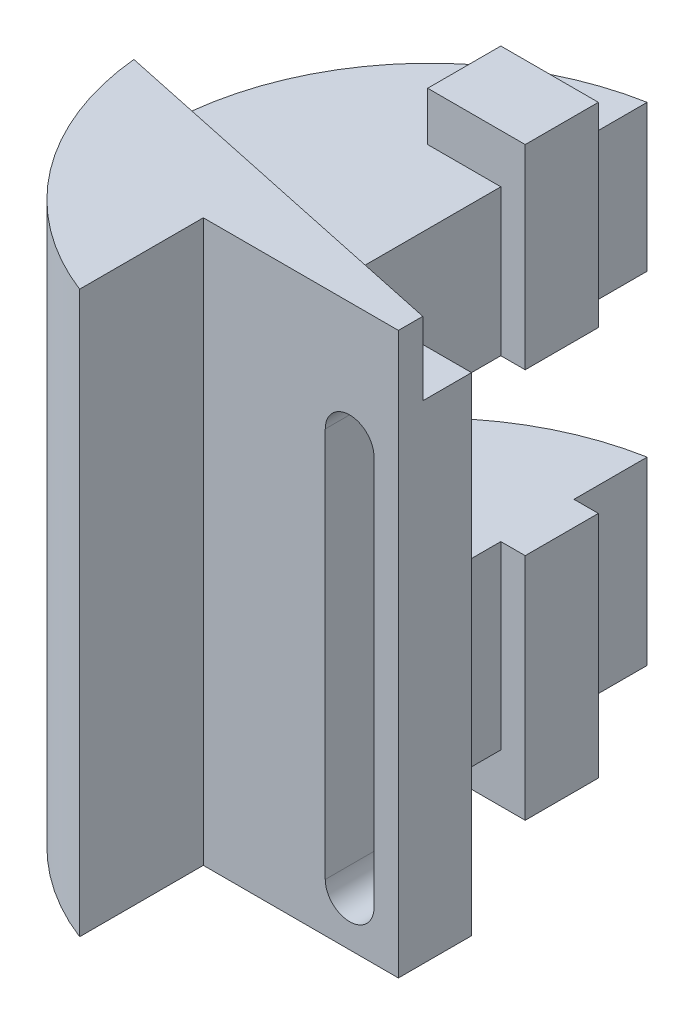
ISO-10303-21;
HEADER;
FILE_DESCRIPTION(('STEP AP214'),'2;1');
FILE_NAME('part.step','',(''),(''),'','','');
FILE_SCHEMA(('AUTOMOTIVE_DESIGN { 1 0 10303 214 1 1 1 1 }'));
ENDSEC;
DATA;
#1=APPLICATION_CONTEXT('core data for automotive mechanical design processes');
#2=APPLICATION_PROTOCOL_DEFINITION('international standard','automotive_design',2000,#1);
#3=PRODUCT_CONTEXT('',#1,'mechanical');
#4=PRODUCT('Part','Part','',(#3));
#5=PRODUCT_RELATED_PRODUCT_CATEGORY('part','',(#4));
#6=PRODUCT_DEFINITION_FORMATION('','',#4);
#7=PRODUCT_DEFINITION_CONTEXT('part definition',#1,'design');
#8=PRODUCT_DEFINITION('design','',#6,#7);
#9=PRODUCT_DEFINITION_SHAPE('','',#8);
#10=(LENGTH_UNIT() NAMED_UNIT(*) SI_UNIT(.MILLI.,.METRE.));
#11=(NAMED_UNIT(*) PLANE_ANGLE_UNIT() SI_UNIT($,.RADIAN.));
#12=(NAMED_UNIT(*) SI_UNIT($,.STERADIAN.) SOLID_ANGLE_UNIT());
#13=UNCERTAINTY_MEASURE_WITH_UNIT(LENGTH_MEASURE(1.E-05),#10,'distance_accuracy_value','');
#14=(GEOMETRIC_REPRESENTATION_CONTEXT(3) GLOBAL_UNCERTAINTY_ASSIGNED_CONTEXT((#13)) GLOBAL_UNIT_ASSIGNED_CONTEXT((#10,
#11,#12)) REPRESENTATION_CONTEXT('',''));
#15=CARTESIAN_POINT('',(0.,0.,0.));
#16=DIRECTION('',(0.,0.,1.));
#17=DIRECTION('',(1.,0.,0.));
#18=AXIS2_PLACEMENT_3D('',#15,#16,#17);
#19=CARTESIAN_POINT('',(9.99999999999999,115.,-40.3627969821569));
#20=DIRECTION('',(-1.,0.,0.));
#21=DIRECTION('',(0.,0.,1.));
#22=AXIS2_PLACEMENT_3D('',#19,#20,#21);
#23=PLANE('',#22);
#24=DIRECTION('',(0.,-1.,0.));
#25=VECTOR('',#24,1.);
#26=CARTESIAN_POINT('',(9.99999999999999,115.,-106.362796982157));
#27=LINE('',#26,#25);
#28=CARTESIAN_POINT('',(9.99999999999997,37.,-106.362796982157));
#29=VERTEX_POINT('',#28);
#30=CARTESIAN_POINT('',(9.99999999999999,0.,-106.362796982157));
#31=VERTEX_POINT('',#30);
#32=EDGE_CURVE('E362',#29,#31,#27,.T.);
#33=ORIENTED_EDGE('',*,*,#32,.F.);
#34=DIRECTION('',(0.,0.,1.));
#35=VECTOR('',#34,1.);
#36=CARTESIAN_POINT('',(9.99999999999999,37.,-40.3627969821569));
#37=LINE('',#36,#35);
#38=CARTESIAN_POINT('',(9.99999999999999,37.,-91.362796982157));
#39=VERTEX_POINT('',#38);
#40=EDGE_CURVE('E272',#29,#39,#37,.T.);
#41=ORIENTED_EDGE('',*,*,#40,.T.);
#42=DIRECTION('',(0.,-1.,0.));
#43=VECTOR('',#42,1.);
#44=CARTESIAN_POINT('',(9.99999999999999,115.,-91.362796982157));
#45=LINE('',#44,#43);
#46=CARTESIAN_POINT('',(9.99999999999999,0.,-91.362796982157));
#47=VERTEX_POINT('',#46);
#48=EDGE_CURVE('E323',#39,#47,#45,.T.);
#49=ORIENTED_EDGE('',*,*,#48,.T.);
#50=DIRECTION('',(0.,0.,-1.));
#51=VECTOR('',#50,1.);
#52=CARTESIAN_POINT('',(9.99999999999999,0.,-40.3627969821569));
#53=LINE('',#52,#51);
#54=EDGE_CURVE('E375',#47,#31,#53,.T.);
#55=ORIENTED_EDGE('',*,*,#54,.T.);
#56=EDGE_LOOP('',(#33,#41,#49,#55));
#57=FACE_BOUND('',#56,.T.);
#58=ADVANCED_FACE('F39',(#57),#23,.F.);
#59=CARTESIAN_POINT('',(-5.00000000000001,-45.,-91.362796982157));
#60=DIRECTION('',(0.,0.,-1.));
#61=DIRECTION('',(-1.,0.,0.));
#62=AXIS2_PLACEMENT_3D('',#59,#60,#61);
#63=PLANE('',#62);
#64=DIRECTION('',(-1.,0.,0.));
#65=VECTOR('',#64,1.);
#66=CARTESIAN_POINT('',(-5.00000000000001,37.,-91.362796982157));
#67=LINE('',#66,#65);
#68=CARTESIAN_POINT('',(15.,37.,-91.362796982157));
#69=VERTEX_POINT('',#68);
#70=EDGE_CURVE('E270',#69,#39,#67,.T.);
#71=ORIENTED_EDGE('',*,*,#70,.F.);
#72=DIRECTION('',(0.,1.,0.));
#73=VECTOR('',#72,1.);
#74=CARTESIAN_POINT('',(15.,-45.,-91.362796982157));
#75=LINE('',#74,#73);
#76=CARTESIAN_POINT('',(15.,-10.,-91.362796982157));
#77=VERTEX_POINT('',#76);
#78=EDGE_CURVE('E305',#77,#69,#75,.T.);
#79=ORIENTED_EDGE('',*,*,#78,.F.);
#80=DIRECTION('',(1.,0.,0.));
#81=VECTOR('',#80,1.);
#82=CARTESIAN_POINT('',(-5.00000000000001,-10.,-91.362796982157));
#83=LINE('',#82,#81);
#84=CARTESIAN_POINT('',(-5.00000000000001,-10.,-91.362796982157));
#85=VERTEX_POINT('',#84);
#86=EDGE_CURVE('E284',#85,#77,#83,.T.);
#87=ORIENTED_EDGE('',*,*,#86,.F.);
#88=DIRECTION('',(0.,1.,0.));
#89=VECTOR('',#88,1.);
#90=CARTESIAN_POINT('',(-5.00000000000001,-45.,-91.362796982157));
#91=LINE('',#90,#89);
#92=CARTESIAN_POINT('',(-5.00000000000002,0.,-91.362796982157));
#93=VERTEX_POINT('',#92);
#94=EDGE_CURVE('E285',#85,#93,#91,.T.);
#95=ORIENTED_EDGE('',*,*,#94,.T.);
#96=DIRECTION('',(-1.,0.,0.));
#97=VECTOR('',#96,1.);
#98=CARTESIAN_POINT('',(20.,0.,-91.362796982157));
#99=LINE('',#98,#97);
#100=EDGE_CURVE('E327',#47,#93,#99,.T.);
#101=ORIENTED_EDGE('',*,*,#100,.F.);
#102=ORIENTED_EDGE('',*,*,#48,.F.);
#103=EDGE_LOOP('',(#71,#79,#87,#95,#101,#102));
#104=FACE_BOUND('',#103,.T.);
#105=ADVANCED_FACE('F434',(#104),#63,.T.);
#106=CARTESIAN_POINT('',(-5.00000000000001,-45.,-76.362796982157));
#107=DIRECTION('',(0.,0.,1.));
#108=DIRECTION('',(1.,0.,0.));
#109=AXIS2_PLACEMENT_3D('',#106,#107,#108);
#110=PLANE('',#109);
#111=DIRECTION('',(1.,0.,0.));
#112=VECTOR('',#111,1.);
#113=CARTESIAN_POINT('',(-5.00000000000001,37.,-76.362796982157));
#114=LINE('',#113,#112);
#115=CARTESIAN_POINT('',(9.99999999999999,37.,-76.362796982157));
#116=VERTEX_POINT('',#115);
#117=CARTESIAN_POINT('',(15.,37.,-76.362796982157));
#118=VERTEX_POINT('',#117);
#119=EDGE_CURVE('E265',#116,#118,#114,.T.);
#120=ORIENTED_EDGE('',*,*,#119,.F.);
#121=DIRECTION('',(0.,1.,0.));
#122=VECTOR('',#121,1.);
#123=CARTESIAN_POINT('',(9.99999999999999,115.,-76.362796982157));
#124=LINE('',#123,#122);
#125=CARTESIAN_POINT('',(9.99999999999999,0.,-76.362796982157));
#126=VERTEX_POINT('',#125);
#127=EDGE_CURVE('E318',#126,#116,#124,.T.);
#128=ORIENTED_EDGE('',*,*,#127,.F.);
#129=DIRECTION('',(1.,0.,0.));
#130=VECTOR('',#129,1.);
#131=CARTESIAN_POINT('',(20.,0.,-76.362796982157));
#132=LINE('',#131,#130);
#133=CARTESIAN_POINT('',(-5.00000000000001,0.,-76.362796982157));
#134=VERTEX_POINT('',#133);
#135=EDGE_CURVE('E321',#134,#126,#132,.T.);
#136=ORIENTED_EDGE('',*,*,#135,.F.);
#137=DIRECTION('',(0.,1.,0.));
#138=VECTOR('',#137,1.);
#139=CARTESIAN_POINT('',(-5.00000000000001,-45.,-76.362796982157));
#140=LINE('',#139,#138);
#141=CARTESIAN_POINT('',(-5.00000000000001,-10.,-76.362796982157));
#142=VERTEX_POINT('',#141);
#143=EDGE_CURVE('E313',#142,#134,#140,.T.);
#144=ORIENTED_EDGE('',*,*,#143,.F.);
#145=DIRECTION('',(-1.,0.,0.));
#146=VECTOR('',#145,1.);
#147=CARTESIAN_POINT('',(-5.00000000000001,-10.,-76.362796982157));
#148=LINE('',#147,#146);
#149=CARTESIAN_POINT('',(15.,-10.,-76.362796982157));
#150=VERTEX_POINT('',#149);
#151=EDGE_CURVE('E289',#150,#142,#148,.T.);
#152=ORIENTED_EDGE('',*,*,#151,.F.);
#153=DIRECTION('',(0.,1.,0.));
#154=VECTOR('',#153,1.);
#155=CARTESIAN_POINT('',(15.,-45.,-76.362796982157));
#156=LINE('',#155,#154);
#157=EDGE_CURVE('E309',#150,#118,#156,.T.);
#158=ORIENTED_EDGE('',*,*,#157,.T.);
#159=EDGE_LOOP('',(#120,#128,#136,#144,#152,#158));
#160=FACE_BOUND('',#159,.T.);
#161=ADVANCED_FACE('F442',(#160),#110,.T.);
#162=CARTESIAN_POINT('',(15.,-45.,-91.362796982157));
#163=DIRECTION('',(1.,0.,0.));
#164=DIRECTION('',(0.,0.,-1.));
#165=AXIS2_PLACEMENT_3D('',#162,#163,#164);
#166=PLANE('',#165);
#167=DIRECTION('',(0.,0.,-1.));
#168=VECTOR('',#167,1.);
#169=CARTESIAN_POINT('',(15.,37.,-91.3627969821569));
#170=LINE('',#169,#168);
#171=EDGE_CURVE('E405',#118,#69,#170,.T.);
#172=ORIENTED_EDGE('',*,*,#171,.F.);
#173=ORIENTED_EDGE('',*,*,#157,.F.);
#174=DIRECTION('',(0.,0.,1.));
#175=VECTOR('',#174,1.);
#176=CARTESIAN_POINT('',(15.,-10.,-91.362796982157));
#177=LINE('',#176,#175);
#178=EDGE_CURVE('E282',#77,#150,#177,.T.);
#179=ORIENTED_EDGE('',*,*,#178,.F.);
#180=ORIENTED_EDGE('',*,*,#78,.T.);
#181=EDGE_LOOP('',(#172,#173,#179,#180));
#182=FACE_BOUND('',#181,.T.);
#183=ADVANCED_FACE('F450',(#182),#166,.T.);
#184=CARTESIAN_POINT('',(9.99999999999999,100.,-91.362796982157));
#185=VERTEX_POINT('',#184);
#186=CARTESIAN_POINT('',(9.99999999999999,70.,-91.362796982157));
#187=VERTEX_POINT('',#186);
#188=EDGE_CURVE('E324',#185,#187,#45,.T.);
#189=ORIENTED_EDGE('',*,*,#188,.T.);
#190=DIRECTION('',(0.,0.,-1.));
#191=VECTOR('',#190,1.);
#192=CARTESIAN_POINT('',(9.99999999999999,70.,-40.3627969821569));
#193=LINE('',#192,#191);
#194=CARTESIAN_POINT('',(9.99999999999997,70.,-106.362796982157));
#195=VERTEX_POINT('',#194);
#196=EDGE_CURVE('E259',#187,#195,#193,.T.);
#197=ORIENTED_EDGE('',*,*,#196,.T.);
#198=CARTESIAN_POINT('',(10.,100.,-106.362796982157));
#199=VERTEX_POINT('',#198);
#200=EDGE_CURVE('E378',#199,#195,#27,.T.);
#201=ORIENTED_EDGE('',*,*,#200,.F.);
#202=DIRECTION('',(0.,0.,-1.));
#203=VECTOR('',#202,1.);
#204=CARTESIAN_POINT('',(9.99999999999999,100.,-40.3627969821569));
#205=LINE('',#204,#203);
#206=EDGE_CURVE('E336',#185,#199,#205,.T.);
#207=ORIENTED_EDGE('',*,*,#206,.F.);
#208=EDGE_LOOP('',(#189,#197,#201,#207));
#209=FACE_BOUND('',#208,.T.);
#210=ADVANCED_FACE('F437',(#209),#23,.F.);
#211=CARTESIAN_POINT('',(40.,115.,-40.3627969821569));
#212=DIRECTION('',(0.,0.,1.));
#213=DIRECTION('',(1.,0.,0.));
#214=AXIS2_PLACEMENT_3D('',#211,#212,#213);
#215=PLANE('',#214);
#216=DIRECTION('',(0.,-1.,0.));
#217=VECTOR('',#216,1.);
#218=CARTESIAN_POINT('',(35.,90.,-40.3627969821569));
#219=LINE('',#218,#217);
#220=CARTESIAN_POINT('',(35.,90.,-40.3627969821569));
#221=VERTEX_POINT('',#220);
#222=CARTESIAN_POINT('',(35.,10.,-40.3627969821569));
#223=VERTEX_POINT('',#222);
#224=EDGE_CURVE('E230',#221,#223,#219,.T.);
#225=ORIENTED_EDGE('',*,*,#224,.F.);
#226=CARTESIAN_POINT('',(30.,90.,-40.3627969821569));
#227=DIRECTION('',(0.,0.,-1.));
#228=DIRECTION('',(-1.,0.,0.));
#229=AXIS2_PLACEMENT_3D('',#226,#227,#228);
#230=CIRCLE('',#229,5.);
#231=CARTESIAN_POINT('',(25.,90.,-40.3627969821569));
#232=VERTEX_POINT('',#231);
#233=EDGE_CURVE('E54',#232,#221,#230,.T.);
#234=ORIENTED_EDGE('',*,*,#233,.F.);
#235=DIRECTION('',(0.,1.,0.));
#236=VECTOR('',#235,1.);
#237=CARTESIAN_POINT('',(25.,90.,-40.3627969821569));
#238=LINE('',#237,#236);
#239=CARTESIAN_POINT('',(25.,10.,-40.3627969821569));
#240=VERTEX_POINT('',#239);
#241=EDGE_CURVE('E237',#240,#232,#238,.T.);
#242=ORIENTED_EDGE('',*,*,#241,.F.);
#243=CARTESIAN_POINT('',(30.,10.,-40.3627969821569));
#244=DIRECTION('',(0.,0.,-1.));
#245=DIRECTION('',(-1.,0.,0.));
#246=AXIS2_PLACEMENT_3D('',#243,#244,#245);
#247=CIRCLE('',#246,5.);
#248=EDGE_CURVE('E221',#223,#240,#247,.T.);
#249=ORIENTED_EDGE('',*,*,#248,.F.);
#250=EDGE_LOOP('',(#225,#234,#242,#249));
#251=FACE_BOUND('',#250,.T.);
#252=DIRECTION('',(-1.,0.,0.));
#253=VECTOR('',#252,1.);
#254=CARTESIAN_POINT('',(40.,100.,-40.3627969821569));
#255=LINE('',#254,#253);
#256=CARTESIAN_POINT('',(40.,100.,-40.3627969821569));
#257=VERTEX_POINT('',#256);
#258=CARTESIAN_POINT('',(9.99999999999999,100.,-40.3627969821569));
#259=VERTEX_POINT('',#258);
#260=EDGE_CURVE('E334',#257,#259,#255,.T.);
#261=ORIENTED_EDGE('',*,*,#260,.F.);
#262=DIRECTION('',(0.,-1.,0.));
#263=VECTOR('',#262,1.);
#264=CARTESIAN_POINT('',(40.,115.,-40.3627969821569));
#265=LINE('',#264,#263);
#266=CARTESIAN_POINT('',(40.,0.,-40.3627969821569));
#267=VERTEX_POINT('',#266);
#268=EDGE_CURVE('E383',#257,#267,#265,.T.);
#269=ORIENTED_EDGE('',*,*,#268,.T.);
#270=DIRECTION('',(-1.,0.,0.));
#271=VECTOR('',#270,1.);
#272=CARTESIAN_POINT('',(40.,0.,-40.3627969821569));
#273=LINE('',#272,#271);
#274=CARTESIAN_POINT('',(9.99999999999999,0.,-40.3627969821569));
#275=VERTEX_POINT('',#274);
#276=EDGE_CURVE('E372',#267,#275,#273,.T.);
#277=ORIENTED_EDGE('',*,*,#276,.T.);
#278=DIRECTION('',(0.,-1.,0.));
#279=VECTOR('',#278,1.);
#280=CARTESIAN_POINT('',(9.99999999999999,115.,-40.3627969821569));
#281=LINE('',#280,#279);
#282=EDGE_CURVE('E381',#259,#275,#281,.T.);
#283=ORIENTED_EDGE('',*,*,#282,.F.);
#284=EDGE_LOOP('',(#261,#269,#277,#283));
#285=FACE_BOUND('',#284,.T.);
#286=ADVANCED_FACE('F234',(#251,#285),#215,.F.);
#287=ORIENTED_EDGE('',*,*,#127,.T.);
#288=DIRECTION('',(0.,0.,1.));
#289=VECTOR('',#288,1.);
#290=CARTESIAN_POINT('',(9.99999999999999,37.,-40.3627969821569));
#291=LINE('',#290,#289);
#292=CARTESIAN_POINT('',(9.99999999999999,37.,-66.3627969821569));
#293=VERTEX_POINT('',#292);
#294=EDGE_CURVE('E267',#116,#293,#291,.T.);
#295=ORIENTED_EDGE('',*,*,#294,.T.);
#296=DIRECTION('',(0.,1.,0.));
#297=VECTOR('',#296,1.);
#298=CARTESIAN_POINT('',(9.99999999999999,115.,-66.3627969821569));
#299=LINE('',#298,#297);
#300=CARTESIAN_POINT('',(9.99999999999999,70.,-66.3627969821569));
#301=VERTEX_POINT('',#300);
#302=EDGE_CURVE('E278',#293,#301,#299,.T.);
#303=ORIENTED_EDGE('',*,*,#302,.T.);
#304=DIRECTION('',(0.,0.,-1.));
#305=VECTOR('',#304,1.);
#306=CARTESIAN_POINT('',(9.99999999999999,70.,-40.3627969821569));
#307=LINE('',#306,#305);
#308=CARTESIAN_POINT('',(9.99999999999999,70.,-76.362796982157));
#309=VERTEX_POINT('',#308);
#310=EDGE_CURVE('E254',#301,#309,#307,.T.);
#311=ORIENTED_EDGE('',*,*,#310,.T.);
#312=CARTESIAN_POINT('',(10.,100.,-76.362796982157));
#313=VERTEX_POINT('',#312);
#314=EDGE_CURVE('E317',#309,#313,#124,.T.);
#315=ORIENTED_EDGE('',*,*,#314,.T.);
#316=EDGE_CURVE('E337',#259,#313,#205,.T.);
#317=ORIENTED_EDGE('',*,*,#316,.F.);
#318=ORIENTED_EDGE('',*,*,#282,.T.);
#319=EDGE_CURVE('E355',#275,#126,#53,.T.);
#320=ORIENTED_EDGE('',*,*,#319,.T.);
#321=EDGE_LOOP('',(#287,#295,#303,#311,#315,#317,#318,#320));
#322=FACE_BOUND('',#321,.T.);
#323=ADVANCED_FACE('F438',(#322),#23,.F.);
#324=CARTESIAN_POINT('',(20.,115.,-51.7711309515255));
#325=DIRECTION('',(0.,-1.,0.));
#326=DIRECTION('',(0.,0.,-1.));
#327=AXIS2_PLACEMENT_3D('',#324,#325,#326);
#328=CYLINDRICAL_SURFACE('',#327,55.5);
#329=DIRECTION('',(0.,-1.,0.));
#330=VECTOR('',#329,1.);
#331=CARTESIAN_POINT('',(-33.5474862383895,115.,-66.3627969821569));
#332=LINE('',#331,#330);
#333=CARTESIAN_POINT('',(-33.5474862383895,70.,-66.3627969821569));
#334=VERTEX_POINT('',#333);
#335=CARTESIAN_POINT('',(-33.5474862383895,37.,-66.3627969821569));
#336=VERTEX_POINT('',#335);
#337=EDGE_CURVE('E407',#334,#336,#332,.T.);
#338=ORIENTED_EDGE('',*,*,#337,.T.);
#339=CARTESIAN_POINT('',(20.,37.,-51.7711309515255));
#340=DIRECTION('',(0.,-1.,0.));
#341=DIRECTION('',(0.,0.,-1.));
#342=AXIS2_PLACEMENT_3D('',#339,#340,#341);
#343=CIRCLE('',#342,55.5);
#344=EDGE_CURVE('E275',#336,#29,#343,.T.);
#345=ORIENTED_EDGE('',*,*,#344,.T.);
#346=ORIENTED_EDGE('',*,*,#32,.T.);
#347=CARTESIAN_POINT('',(20.,0.,-51.7711309515255));
#348=DIRECTION('',(0.,1.,0.));
#349=DIRECTION('',(0.,0.,1.));
#350=AXIS2_PLACEMENT_3D('',#347,#348,#349);
#351=CIRCLE('',#350,55.5);
#352=CARTESIAN_POINT('',(0.,0.,0.));
#353=VERTEX_POINT('',#352);
#354=EDGE_CURVE('E350',#31,#353,#351,.T.);
#355=ORIENTED_EDGE('',*,*,#354,.T.);
#356=DIRECTION('',(0.,-1.,0.));
#357=VECTOR('',#356,1.);
#358=CARTESIAN_POINT('',(0.,115.,0.));
#359=LINE('',#358,#357);
#360=CARTESIAN_POINT('',(0.,115.,0.));
#361=VERTEX_POINT('',#360);
#362=EDGE_CURVE('E391',#361,#353,#359,.T.);
#363=ORIENTED_EDGE('',*,*,#362,.F.);
#364=CARTESIAN_POINT('',(20.,115.,-51.7711309515255));
#365=DIRECTION('',(0.,1.,0.));
#366=DIRECTION('',(0.,0.,1.));
#367=AXIS2_PLACEMENT_3D('',#364,#365,#366);
#368=CIRCLE('',#367,55.5);
#369=CARTESIAN_POINT('',(-35.2350441418964,115.,-46.3544992820505));
#370=VERTEX_POINT('',#369);
#371=EDGE_CURVE('E352',#370,#361,#368,.T.);
#372=ORIENTED_EDGE('',*,*,#371,.F.);
#373=DIRECTION('',(0.,1.,0.));
#374=VECTOR('',#373,1.);
#375=CARTESIAN_POINT('',(-35.2350441418964,100.,-46.3544992820505));
#376=LINE('',#375,#374);
#377=CARTESIAN_POINT('',(-35.2350441418964,100.,-46.3544992820505));
#378=VERTEX_POINT('',#377);
#379=EDGE_CURVE('E345',#378,#370,#376,.T.);
#380=ORIENTED_EDGE('',*,*,#379,.F.);
#381=CARTESIAN_POINT('',(20.,100.,-51.7711309515255));
#382=DIRECTION('',(0.,1.,0.));
#383=DIRECTION('',(0.,0.,1.));
#384=AXIS2_PLACEMENT_3D('',#381,#382,#383);
#385=CIRCLE('',#384,55.5);
#386=EDGE_CURVE('E340',#199,#378,#385,.T.);
#387=ORIENTED_EDGE('',*,*,#386,.F.);
#388=ORIENTED_EDGE('',*,*,#200,.T.);
#389=CARTESIAN_POINT('',(20.,70.,-51.7711309515255));
#390=DIRECTION('',(0.,1.,0.));
#391=DIRECTION('',(0.,0.,1.));
#392=AXIS2_PLACEMENT_3D('',#389,#390,#391);
#393=CIRCLE('',#392,55.5);
#394=EDGE_CURVE('E262',#195,#334,#393,.T.);
#395=ORIENTED_EDGE('',*,*,#394,.T.);
#396=EDGE_LOOP('',(#338,#345,#346,#355,#363,#372,#380,#387,#388,#395));
#397=FACE_BOUND('',#396,.T.);
#398=ADVANCED_FACE('F41',(#397),#328,.T.);
#399=CARTESIAN_POINT('',(0.,115.,0.));
#400=DIRECTION('',(-1.,0.,0.));
#401=DIRECTION('',(0.,0.,1.));
#402=AXIS2_PLACEMENT_3D('',#399,#400,#401);
#403=PLANE('',#402);
#404=DIRECTION('',(0.,0.,-1.));
#405=VECTOR('',#404,1.);
#406=CARTESIAN_POINT('',(0.,0.,0.));
#407=LINE('',#406,#405);
#408=CARTESIAN_POINT('',(0.,0.,-25.3627969821569));
#409=VERTEX_POINT('',#408);
#410=EDGE_CURVE('E365',#353,#409,#407,.T.);
#411=ORIENTED_EDGE('',*,*,#410,.T.);
#412=DIRECTION('',(0.,-1.,0.));
#413=VECTOR('',#412,1.);
#414=CARTESIAN_POINT('',(0.,115.,-25.3627969821569));
#415=LINE('',#414,#413);
#416=CARTESIAN_POINT('',(0.,115.,-25.3627969821569));
#417=VERTEX_POINT('',#416);
#418=EDGE_CURVE('E388',#417,#409,#415,.T.);
#419=ORIENTED_EDGE('',*,*,#418,.F.);
#420=DIRECTION('',(0.,0.,-1.));
#421=VECTOR('',#420,1.);
#422=CARTESIAN_POINT('',(0.,115.,0.));
#423=LINE('',#422,#421);
#424=EDGE_CURVE('E354',#361,#417,#423,.T.);
#425=ORIENTED_EDGE('',*,*,#424,.F.);
#426=ORIENTED_EDGE('',*,*,#362,.T.);
#427=EDGE_LOOP('',(#411,#419,#425,#426));
#428=FACE_BOUND('',#427,.T.);
#429=ADVANCED_FACE('F458',(#428),#403,.F.);
#430=CARTESIAN_POINT('',(0.,115.,-25.3627969821569));
#431=DIRECTION('',(0.,0.,-1.));
#432=DIRECTION('',(-1.,0.,0.));
#433=AXIS2_PLACEMENT_3D('',#430,#431,#432);
#434=PLANE('',#433);
#435=DIRECTION('',(0.,1.,0.));
#436=VECTOR('',#435,1.);
#437=CARTESIAN_POINT('',(25.,115.,-25.3627969821569));
#438=LINE('',#437,#436);
#439=CARTESIAN_POINT('',(25.,10.,-25.3627969821569));
#440=VERTEX_POINT('',#439);
#441=CARTESIAN_POINT('',(25.,90.,-25.3627969821569));
#442=VERTEX_POINT('',#441);
#443=EDGE_CURVE('E47',#440,#442,#438,.T.);
#444=ORIENTED_EDGE('',*,*,#443,.T.);
#445=CARTESIAN_POINT('',(30.,90.,-25.3627969821569));
#446=DIRECTION('',(0.,0.,-1.));
#447=DIRECTION('',(-1.,0.,0.));
#448=AXIS2_PLACEMENT_3D('',#445,#446,#447);
#449=CIRCLE('',#448,5.);
#450=CARTESIAN_POINT('',(35.,90.,-25.3627969821569));
#451=VERTEX_POINT('',#450);
#452=EDGE_CURVE('E12',#442,#451,#449,.T.);
#453=ORIENTED_EDGE('',*,*,#452,.T.);
#454=DIRECTION('',(0.,-1.,0.));
#455=VECTOR('',#454,1.);
#456=CARTESIAN_POINT('',(35.,115.,-25.3627969821569));
#457=LINE('',#456,#455);
#458=CARTESIAN_POINT('',(35.,9.99999999999999,-25.3627969821569));
#459=VERTEX_POINT('',#458);
#460=EDGE_CURVE('E410',#451,#459,#457,.T.);
#461=ORIENTED_EDGE('',*,*,#460,.T.);
#462=CARTESIAN_POINT('',(30.,10.,-25.3627969821569));
#463=DIRECTION('',(0.,0.,-1.));
#464=DIRECTION('',(-1.,0.,0.));
#465=AXIS2_PLACEMENT_3D('',#462,#463,#464);
#466=CIRCLE('',#465,5.);
#467=EDGE_CURVE('E224',#459,#440,#466,.T.);
#468=ORIENTED_EDGE('',*,*,#467,.T.);
#469=EDGE_LOOP('',(#444,#453,#461,#468));
#470=FACE_BOUND('',#469,.T.);
#471=DIRECTION('',(1.,0.,0.));
#472=VECTOR('',#471,1.);
#473=CARTESIAN_POINT('',(0.,0.,-25.3627969821569));
#474=LINE('',#473,#472);
#475=CARTESIAN_POINT('',(40.,0.,-25.3627969821569));
#476=VERTEX_POINT('',#475);
#477=EDGE_CURVE('E367',#409,#476,#474,.T.);
#478=ORIENTED_EDGE('',*,*,#477,.T.);
#479=DIRECTION('',(0.,-1.,0.));
#480=VECTOR('',#479,1.);
#481=CARTESIAN_POINT('',(40.,115.,-25.3627969821569));
#482=LINE('',#481,#480);
#483=CARTESIAN_POINT('',(40.,115.,-25.3627969821569));
#484=VERTEX_POINT('',#483);
#485=EDGE_CURVE('E385',#484,#476,#482,.T.);
#486=ORIENTED_EDGE('',*,*,#485,.F.);
#487=DIRECTION('',(1.,0.,0.));
#488=VECTOR('',#487,1.);
#489=CARTESIAN_POINT('',(0.,115.,-25.3627969821569));
#490=LINE('',#489,#488);
#491=EDGE_CURVE('E357',#417,#484,#490,.T.);
#492=ORIENTED_EDGE('',*,*,#491,.F.);
#493=ORIENTED_EDGE('',*,*,#418,.T.);
#494=EDGE_LOOP('',(#478,#486,#492,#493));
#495=FACE_BOUND('',#494,.T.);
#496=ADVANCED_FACE('F414',(#470,#495),#434,.F.);
#497=CARTESIAN_POINT('',(40.,115.,-25.3627969821569));
#498=DIRECTION('',(-1.,0.,0.));
#499=DIRECTION('',(0.,0.,1.));
#500=AXIS2_PLACEMENT_3D('',#497,#498,#499);
#501=PLANE('',#500);
#502=DIRECTION('',(0.,0.,-1.));
#503=VECTOR('',#502,1.);
#504=CARTESIAN_POINT('',(40.,100.,-30.3627969821569));
#505=LINE('',#504,#503);
#506=CARTESIAN_POINT('',(40.,100.,-30.3627969821569));
#507=VERTEX_POINT('',#506);
#508=EDGE_CURVE('E332',#507,#257,#505,.T.);
#509=ORIENTED_EDGE('',*,*,#508,.F.);
#510=DIRECTION('',(0.,1.,0.));
#511=VECTOR('',#510,1.);
#512=CARTESIAN_POINT('',(40.,100.,-30.3627969821569));
#513=LINE('',#512,#511);
#514=CARTESIAN_POINT('',(40.,115.,-30.3627969821569));
#515=VERTEX_POINT('',#514);
#516=EDGE_CURVE('E347',#507,#515,#513,.T.);
#517=ORIENTED_EDGE('',*,*,#516,.T.);
#518=DIRECTION('',(0.,0.,-1.));
#519=VECTOR('',#518,1.);
#520=CARTESIAN_POINT('',(40.,115.,-25.3627969821569));
#521=LINE('',#520,#519);
#522=EDGE_CURVE('E359',#484,#515,#521,.T.);
#523=ORIENTED_EDGE('',*,*,#522,.F.);
#524=ORIENTED_EDGE('',*,*,#485,.T.);
#525=DIRECTION('',(0.,0.,-1.));
#526=VECTOR('',#525,1.);
#527=CARTESIAN_POINT('',(40.,0.,-25.3627969821569));
#528=LINE('',#527,#526);
#529=EDGE_CURVE('E369',#476,#267,#528,.T.);
#530=ORIENTED_EDGE('',*,*,#529,.T.);
#531=ORIENTED_EDGE('',*,*,#268,.F.);
#532=EDGE_LOOP('',(#509,#517,#523,#524,#530,#531));
#533=FACE_BOUND('',#532,.T.);
#534=ADVANCED_FACE('F517',(#533),#501,.F.);
#535=CARTESIAN_POINT('',(20.,115.,-51.7711309515255));
#536=DIRECTION('',(0.,1.,0.));
#537=DIRECTION('',(0.,0.,1.));
#538=AXIS2_PLACEMENT_3D('',#535,#536,#537);
#539=PLANE('',#538);
#540=DIRECTION('',(0.978147600733806,0.,0.207911690817756));
#541=VECTOR('',#540,1.);
#542=CARTESIAN_POINT('',(40.,115.,-30.3627969821569));
#543=LINE('',#542,#541);
#544=EDGE_CURVE('E331',#370,#515,#543,.T.);
#545=ORIENTED_EDGE('',*,*,#544,.F.);
#546=ORIENTED_EDGE('',*,*,#371,.T.);
#547=ORIENTED_EDGE('',*,*,#424,.T.);
#548=ORIENTED_EDGE('',*,*,#491,.T.);
#549=ORIENTED_EDGE('',*,*,#522,.T.);
#550=EDGE_LOOP('',(#545,#546,#547,#548,#549));
#551=FACE_BOUND('',#550,.T.);
#552=ADVANCED_FACE('F520',(#551),#539,.T.);
#553=CARTESIAN_POINT('',(20.,0.,-51.7711309515255));
#554=DIRECTION('',(0.,1.,0.));
#555=DIRECTION('',(0.,0.,1.));
#556=AXIS2_PLACEMENT_3D('',#553,#554,#555);
#557=PLANE('',#556);
#558=ORIENTED_EDGE('',*,*,#54,.F.);
#559=ORIENTED_EDGE('',*,*,#100,.T.);
#560=DIRECTION('',(0.,0.,1.));
#561=VECTOR('',#560,1.);
#562=CARTESIAN_POINT('',(-5.00000000000001,0.,-51.7711309515255));
#563=LINE('',#562,#561);
#564=EDGE_CURVE('E329',#93,#134,#563,.T.);
#565=ORIENTED_EDGE('',*,*,#564,.T.);
#566=ORIENTED_EDGE('',*,*,#135,.T.);
#567=ORIENTED_EDGE('',*,*,#319,.F.);
#568=ORIENTED_EDGE('',*,*,#276,.F.);
#569=ORIENTED_EDGE('',*,*,#529,.F.);
#570=ORIENTED_EDGE('',*,*,#477,.F.);
#571=ORIENTED_EDGE('',*,*,#410,.F.);
#572=ORIENTED_EDGE('',*,*,#354,.F.);
#573=EDGE_LOOP('',(#558,#559,#565,#566,#567,#568,#569,#570,#571,#572));
#574=FACE_BOUND('',#573,.T.);
#575=ADVANCED_FACE('F529',(#574),#557,.F.);
#576=CARTESIAN_POINT('',(40.,100.,-30.3627969821569));
#577=DIRECTION('',(-0.207911690817756,0.,0.978147600733806));
#578=DIRECTION('',(0.978147600733806,0.,0.207911690817756));
#579=AXIS2_PLACEMENT_3D('',#576,#577,#578);
#580=PLANE('',#579);
#581=ORIENTED_EDGE('',*,*,#544,.T.);
#582=ORIENTED_EDGE('',*,*,#516,.F.);
#583=DIRECTION('',(0.978147600733806,0.,0.207911690817756));
#584=VECTOR('',#583,1.);
#585=CARTESIAN_POINT('',(40.,100.,-30.3627969821569));
#586=LINE('',#585,#584);
#587=EDGE_CURVE('E342',#378,#507,#586,.T.);
#588=ORIENTED_EDGE('',*,*,#587,.F.);
#589=ORIENTED_EDGE('',*,*,#379,.T.);
#590=EDGE_LOOP('',(#581,#582,#588,#589));
#591=FACE_BOUND('',#590,.T.);
#592=ADVANCED_FACE('F513',(#591),#580,.F.);
#593=CARTESIAN_POINT('',(20.,100.,-51.7711309515255));
#594=DIRECTION('',(0.,1.,0.));
#595=DIRECTION('',(0.,0.,1.));
#596=AXIS2_PLACEMENT_3D('',#593,#594,#595);
#597=PLANE('',#596);
#598=DIRECTION('',(-1.,0.,0.));
#599=VECTOR('',#598,1.);
#600=CARTESIAN_POINT('',(20.,100.,-91.362796982157));
#601=LINE('',#600,#599);
#602=CARTESIAN_POINT('',(-5.00000000000002,100.,-91.362796982157));
#603=VERTEX_POINT('',#602);
#604=EDGE_CURVE('E400',#185,#603,#601,.T.);
#605=ORIENTED_EDGE('',*,*,#604,.F.);
#606=ORIENTED_EDGE('',*,*,#206,.T.);
#607=ORIENTED_EDGE('',*,*,#386,.T.);
#608=ORIENTED_EDGE('',*,*,#587,.T.);
#609=ORIENTED_EDGE('',*,*,#508,.T.);
#610=ORIENTED_EDGE('',*,*,#260,.T.);
#611=ORIENTED_EDGE('',*,*,#316,.T.);
#612=DIRECTION('',(1.,0.,0.));
#613=VECTOR('',#612,1.);
#614=CARTESIAN_POINT('',(20.,100.,-76.362796982157));
#615=LINE('',#614,#613);
#616=CARTESIAN_POINT('',(-5.00000000000001,100.,-76.362796982157));
#617=VERTEX_POINT('',#616);
#618=EDGE_CURVE('E394',#617,#313,#615,.T.);
#619=ORIENTED_EDGE('',*,*,#618,.F.);
#620=DIRECTION('',(0.,0.,1.));
#621=VECTOR('',#620,1.);
#622=CARTESIAN_POINT('',(-5.00000000000001,100.,-51.7711309515255));
#623=LINE('',#622,#621);
#624=EDGE_CURVE('E397',#603,#617,#623,.T.);
#625=ORIENTED_EDGE('',*,*,#624,.F.);
#626=EDGE_LOOP('',(#605,#606,#607,#608,#609,#610,#611,#619,#625));
#627=FACE_BOUND('',#626,.T.);
#628=ADVANCED_FACE('F495',(#627),#597,.T.);
#629=CARTESIAN_POINT('',(-5.00000000000001,-45.,-91.362796982157));
#630=DIRECTION('',(-1.,0.,0.));
#631=DIRECTION('',(0.,0.,1.));
#632=AXIS2_PLACEMENT_3D('',#629,#630,#631);
#633=PLANE('',#632);
#634=ORIENTED_EDGE('',*,*,#564,.F.);
#635=ORIENTED_EDGE('',*,*,#94,.F.);
#636=DIRECTION('',(0.,0.,-1.));
#637=VECTOR('',#636,1.);
#638=CARTESIAN_POINT('',(-5.00000000000001,-10.,-91.362796982157));
#639=LINE('',#638,#637);
#640=EDGE_CURVE('E287',#142,#85,#639,.T.);
#641=ORIENTED_EDGE('',*,*,#640,.F.);
#642=ORIENTED_EDGE('',*,*,#143,.T.);
#643=EDGE_LOOP('',(#634,#635,#641,#642));
#644=FACE_BOUND('',#643,.T.);
#645=ADVANCED_FACE('F534',(#644),#633,.T.);
#646=DIRECTION('',(1.,0.,0.));
#647=VECTOR('',#646,1.);
#648=CARTESIAN_POINT('',(-5.00000000000001,70.,-91.362796982157));
#649=LINE('',#648,#647);
#650=CARTESIAN_POINT('',(15.,70.,-91.362796982157));
#651=VERTEX_POINT('',#650);
#652=EDGE_CURVE('E257',#187,#651,#649,.T.);
#653=ORIENTED_EDGE('',*,*,#652,.F.);
#654=ORIENTED_EDGE('',*,*,#188,.F.);
#655=ORIENTED_EDGE('',*,*,#604,.T.);
#656=CARTESIAN_POINT('',(-5.00000000000001,110.,-91.362796982157));
#657=VERTEX_POINT('',#656);
#658=EDGE_CURVE('E304',#603,#657,#91,.T.);
#659=ORIENTED_EDGE('',*,*,#658,.T.);
#660=DIRECTION('',(-1.,0.,0.));
#661=VECTOR('',#660,1.);
#662=CARTESIAN_POINT('',(-5.00000000000001,110.,-91.362796982157));
#663=LINE('',#662,#661);
#664=CARTESIAN_POINT('',(15.,110.,-91.362796982157));
#665=VERTEX_POINT('',#664);
#666=EDGE_CURVE('E298',#665,#657,#663,.T.);
#667=ORIENTED_EDGE('',*,*,#666,.F.);
#668=EDGE_CURVE('E308',#651,#665,#75,.T.);
#669=ORIENTED_EDGE('',*,*,#668,.F.);
#670=EDGE_LOOP('',(#653,#654,#655,#659,#667,#669));
#671=FACE_BOUND('',#670,.T.);
#672=ADVANCED_FACE('F445',(#671),#63,.T.);
#673=DIRECTION('',(-1.,0.,0.));
#674=VECTOR('',#673,1.);
#675=CARTESIAN_POINT('',(-5.00000000000001,70.,-76.362796982157));
#676=LINE('',#675,#674);
#677=CARTESIAN_POINT('',(15.,70.,-76.362796982157));
#678=VERTEX_POINT('',#677);
#679=EDGE_CURVE('E250',#678,#309,#676,.T.);
#680=ORIENTED_EDGE('',*,*,#679,.F.);
#681=CARTESIAN_POINT('',(15.,110.,-76.362796982157));
#682=VERTEX_POINT('',#681);
#683=EDGE_CURVE('E312',#678,#682,#156,.T.);
#684=ORIENTED_EDGE('',*,*,#683,.T.);
#685=DIRECTION('',(1.,0.,0.));
#686=VECTOR('',#685,1.);
#687=CARTESIAN_POINT('',(-5.00000000000001,110.,-76.362796982157));
#688=LINE('',#687,#686);
#689=CARTESIAN_POINT('',(-5.00000000000001,110.,-76.362796982157));
#690=VERTEX_POINT('',#689);
#691=EDGE_CURVE('E292',#690,#682,#688,.T.);
#692=ORIENTED_EDGE('',*,*,#691,.F.);
#693=EDGE_CURVE('E301',#617,#690,#140,.T.);
#694=ORIENTED_EDGE('',*,*,#693,.F.);
#695=ORIENTED_EDGE('',*,*,#618,.T.);
#696=ORIENTED_EDGE('',*,*,#314,.F.);
#697=EDGE_LOOP('',(#680,#684,#692,#694,#695,#696));
#698=FACE_BOUND('',#697,.T.);
#699=ADVANCED_FACE('F490',(#698),#110,.T.);
#700=ORIENTED_EDGE('',*,*,#658,.F.);
#701=ORIENTED_EDGE('',*,*,#624,.T.);
#702=ORIENTED_EDGE('',*,*,#693,.T.);
#703=DIRECTION('',(0.,0.,1.));
#704=VECTOR('',#703,1.);
#705=CARTESIAN_POINT('',(-5.00000000000001,110.,-91.362796982157));
#706=LINE('',#705,#704);
#707=EDGE_CURVE('E281',#657,#690,#706,.T.);
#708=ORIENTED_EDGE('',*,*,#707,.F.);
#709=EDGE_LOOP('',(#700,#701,#702,#708));
#710=FACE_BOUND('',#709,.T.);
#711=ADVANCED_FACE('F498',(#710),#633,.T.);
#712=DIRECTION('',(0.,0.,1.));
#713=VECTOR('',#712,1.);
#714=CARTESIAN_POINT('',(15.,70.,-91.362796982157));
#715=LINE('',#714,#713);
#716=EDGE_CURVE('E403',#651,#678,#715,.T.);
#717=ORIENTED_EDGE('',*,*,#716,.F.);
#718=ORIENTED_EDGE('',*,*,#668,.T.);
#719=DIRECTION('',(0.,0.,-1.));
#720=VECTOR('',#719,1.);
#721=CARTESIAN_POINT('',(15.,110.,-91.362796982157));
#722=LINE('',#721,#720);
#723=EDGE_CURVE('E295',#682,#665,#722,.T.);
#724=ORIENTED_EDGE('',*,*,#723,.F.);
#725=ORIENTED_EDGE('',*,*,#683,.F.);
#726=EDGE_LOOP('',(#717,#718,#724,#725));
#727=FACE_BOUND('',#726,.T.);
#728=ADVANCED_FACE('F546',(#727),#166,.T.);
#729=CARTESIAN_POINT('',(0.,110.,0.));
#730=DIRECTION('',(0.,1.,0.));
#731=DIRECTION('',(0.,0.,1.));
#732=AXIS2_PLACEMENT_3D('',#729,#730,#731);
#733=PLANE('',#732);
#734=ORIENTED_EDGE('',*,*,#707,.T.);
#735=ORIENTED_EDGE('',*,*,#691,.T.);
#736=ORIENTED_EDGE('',*,*,#723,.T.);
#737=ORIENTED_EDGE('',*,*,#666,.T.);
#738=EDGE_LOOP('',(#734,#735,#736,#737));
#739=FACE_BOUND('',#738,.T.);
#740=ADVANCED_FACE('F539',(#739),#733,.T.);
#741=CARTESIAN_POINT('',(20.,-10.,-51.7711309515255));
#742=DIRECTION('',(0.,1.,0.));
#743=DIRECTION('',(0.,0.,1.));
#744=AXIS2_PLACEMENT_3D('',#741,#742,#743);
#745=PLANE('',#744);
#746=ORIENTED_EDGE('',*,*,#640,.T.);
#747=ORIENTED_EDGE('',*,*,#86,.T.);
#748=ORIENTED_EDGE('',*,*,#178,.T.);
#749=ORIENTED_EDGE('',*,*,#151,.T.);
#750=EDGE_LOOP('',(#746,#747,#748,#749));
#751=FACE_BOUND('',#750,.T.);
#752=ADVANCED_FACE('F537',(#751),#745,.F.);
#753=CARTESIAN_POINT('',(-35.5,70.,-66.3627969821569));
#754=DIRECTION('',(0.,0.,1.));
#755=DIRECTION('',(1.,0.,0.));
#756=AXIS2_PLACEMENT_3D('',#753,#754,#755);
#757=PLANE('',#756);
#758=DIRECTION('',(1.,0.,0.));
#759=VECTOR('',#758,1.);
#760=CARTESIAN_POINT('',(-35.5,37.,-66.3627969821569));
#761=LINE('',#760,#759);
#762=EDGE_CURVE('E247',#336,#293,#761,.T.);
#763=ORIENTED_EDGE('',*,*,#762,.F.);
#764=ORIENTED_EDGE('',*,*,#337,.F.);
#765=DIRECTION('',(1.,0.,0.));
#766=VECTOR('',#765,1.);
#767=CARTESIAN_POINT('',(-35.5,70.,-66.3627969821569));
#768=LINE('',#767,#766);
#769=EDGE_CURVE('E244',#334,#301,#768,.T.);
#770=ORIENTED_EDGE('',*,*,#769,.T.);
#771=ORIENTED_EDGE('',*,*,#302,.F.);
#772=EDGE_LOOP('',(#763,#764,#770,#771));
#773=FACE_BOUND('',#772,.T.);
#774=ADVANCED_FACE('F484',(#773),#757,.F.);
#775=CARTESIAN_POINT('',(-35.5,37.,-106.362796982157));
#776=DIRECTION('',(0.,-1.,0.));
#777=DIRECTION('',(0.,0.,-1.));
#778=AXIS2_PLACEMENT_3D('',#775,#776,#777);
#779=PLANE('',#778);
#780=ORIENTED_EDGE('',*,*,#762,.T.);
#781=ORIENTED_EDGE('',*,*,#294,.F.);
#782=ORIENTED_EDGE('',*,*,#119,.T.);
#783=ORIENTED_EDGE('',*,*,#171,.T.);
#784=ORIENTED_EDGE('',*,*,#70,.T.);
#785=ORIENTED_EDGE('',*,*,#40,.F.);
#786=ORIENTED_EDGE('',*,*,#344,.F.);
#787=EDGE_LOOP('',(#780,#781,#782,#783,#784,#785,#786));
#788=FACE_BOUND('',#787,.T.);
#789=ADVANCED_FACE('F428',(#788),#779,.F.);
#790=CARTESIAN_POINT('',(-35.5,70.,-106.362796982157));
#791=DIRECTION('',(0.,1.,0.));
#792=DIRECTION('',(0.,0.,1.));
#793=AXIS2_PLACEMENT_3D('',#790,#791,#792);
#794=PLANE('',#793);
#795=ORIENTED_EDGE('',*,*,#196,.F.);
#796=ORIENTED_EDGE('',*,*,#652,.T.);
#797=ORIENTED_EDGE('',*,*,#716,.T.);
#798=ORIENTED_EDGE('',*,*,#679,.T.);
#799=ORIENTED_EDGE('',*,*,#310,.F.);
#800=ORIENTED_EDGE('',*,*,#769,.F.);
#801=ORIENTED_EDGE('',*,*,#394,.F.);
#802=EDGE_LOOP('',(#795,#796,#797,#798,#799,#800,#801));
#803=FACE_BOUND('',#802,.T.);
#804=ADVANCED_FACE('F421',(#803),#794,.F.);
#805=CARTESIAN_POINT('',(30.,90.,0.));
#806=DIRECTION('',(0.,0.,-1.));
#807=DIRECTION('',(-1.,0.,0.));
#808=AXIS2_PLACEMENT_3D('',#805,#806,#807);
#809=CYLINDRICAL_SURFACE('',#808,5.);
#810=DIRECTION('',(0.,0.,-1.));
#811=VECTOR('',#810,1.);
#812=CARTESIAN_POINT('',(25.,90.,0.));
#813=LINE('',#812,#811);
#814=EDGE_CURVE('E242',#442,#232,#813,.T.);
#815=ORIENTED_EDGE('',*,*,#814,.T.);
#816=ORIENTED_EDGE('',*,*,#233,.T.);
#817=DIRECTION('',(0.,0.,-1.));
#818=VECTOR('',#817,1.);
#819=CARTESIAN_POINT('',(35.,90.,0.));
#820=LINE('',#819,#818);
#821=EDGE_CURVE('E227',#451,#221,#820,.T.);
#822=ORIENTED_EDGE('',*,*,#821,.F.);
#823=ORIENTED_EDGE('',*,*,#452,.F.);
#824=EDGE_LOOP('',(#815,#816,#822,#823));
#825=FACE_BOUND('',#824,.T.);
#826=ADVANCED_FACE('F419',(#825),#809,.F.);
#827=CARTESIAN_POINT('',(25.,90.,0.));
#828=DIRECTION('',(-1.,0.,0.));
#829=DIRECTION('',(0.,0.,1.));
#830=AXIS2_PLACEMENT_3D('',#827,#828,#829);
#831=PLANE('',#830);
#832=DIRECTION('',(0.,0.,-1.));
#833=VECTOR('',#832,1.);
#834=CARTESIAN_POINT('',(25.,10.,0.));
#835=LINE('',#834,#833);
#836=EDGE_CURVE('E226',#440,#240,#835,.T.);
#837=ORIENTED_EDGE('',*,*,#836,.T.);
#838=ORIENTED_EDGE('',*,*,#241,.T.);
#839=ORIENTED_EDGE('',*,*,#814,.F.);
#840=ORIENTED_EDGE('',*,*,#443,.F.);
#841=EDGE_LOOP('',(#837,#838,#839,#840));
#842=FACE_BOUND('',#841,.T.);
#843=ADVANCED_FACE('F418',(#842),#831,.F.);
#844=CARTESIAN_POINT('',(30.,10.,0.));
#845=DIRECTION('',(0.,0.,-1.));
#846=DIRECTION('',(-1.,0.,0.));
#847=AXIS2_PLACEMENT_3D('',#844,#845,#846);
#848=CYLINDRICAL_SURFACE('',#847,5.);
#849=DIRECTION('',(0.,0.,-1.));
#850=VECTOR('',#849,1.);
#851=CARTESIAN_POINT('',(35.,10.,0.));
#852=LINE('',#851,#850);
#853=EDGE_CURVE('E62',#459,#223,#852,.T.);
#854=ORIENTED_EDGE('',*,*,#853,.T.);
#855=ORIENTED_EDGE('',*,*,#248,.T.);
#856=ORIENTED_EDGE('',*,*,#836,.F.);
#857=ORIENTED_EDGE('',*,*,#467,.F.);
#858=EDGE_LOOP('',(#854,#855,#856,#857));
#859=FACE_BOUND('',#858,.T.);
#860=ADVANCED_FACE('F218',(#859),#848,.F.);
#861=CARTESIAN_POINT('',(35.,90.,0.));
#862=DIRECTION('',(1.,0.,0.));
#863=DIRECTION('',(0.,0.,-1.));
#864=AXIS2_PLACEMENT_3D('',#861,#862,#863);
#865=PLANE('',#864);
#866=ORIENTED_EDGE('',*,*,#821,.T.);
#867=ORIENTED_EDGE('',*,*,#224,.T.);
#868=ORIENTED_EDGE('',*,*,#853,.F.);
#869=ORIENTED_EDGE('',*,*,#460,.F.);
#870=EDGE_LOOP('',(#866,#867,#868,#869));
#871=FACE_BOUND('',#870,.T.);
#872=ADVANCED_FACE('F231',(#871),#865,.F.);
#873=CLOSED_SHELL('',(#58,#105,#161,#183,#210,#286,#323,#398,#429,#496,#534,#552,#575,#592,#628,
#645,#672,#699,#711,#728,#740,#752,#774,#789,#804,#826,#843,#860,#872));
#874=MANIFOLD_SOLID_BREP('B2',#873);
#875=ADVANCED_BREP_SHAPE_REPRESENTATION('',(#18,#874),#14);
#876=SHAPE_DEFINITION_REPRESENTATION(#9,#875);
ENDSEC;
END-ISO-10303-21;
